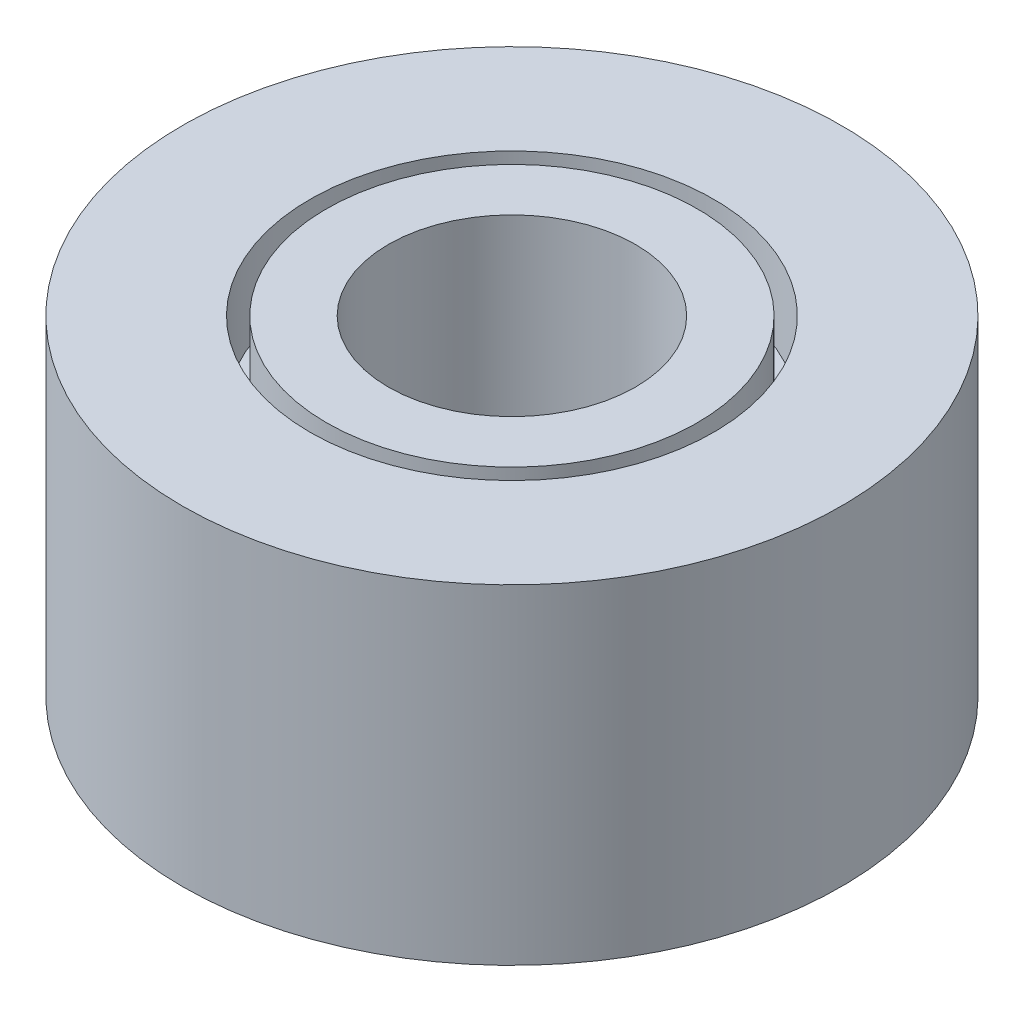
ISO-10303-21;
HEADER;
FILE_DESCRIPTION(('STEP AP214'),'2;1');
FILE_NAME('part.step','',(''),(''),'','','');
FILE_SCHEMA(('AUTOMOTIVE_DESIGN { 1 0 10303 214 1 1 1 1 }'));
ENDSEC;
DATA;
#1=APPLICATION_CONTEXT('core data for automotive mechanical design processes');
#2=APPLICATION_PROTOCOL_DEFINITION('international standard','automotive_design',2000,#1);
#3=PRODUCT_CONTEXT('',#1,'mechanical');
#4=PRODUCT('Part','Part','',(#3));
#5=PRODUCT_RELATED_PRODUCT_CATEGORY('part','',(#4));
#6=PRODUCT_DEFINITION_FORMATION('','',#4);
#7=PRODUCT_DEFINITION_CONTEXT('part definition',#1,'design');
#8=PRODUCT_DEFINITION('design','',#6,#7);
#9=PRODUCT_DEFINITION_SHAPE('','',#8);
#10=(LENGTH_UNIT() NAMED_UNIT(*) SI_UNIT(.MILLI.,.METRE.));
#11=(NAMED_UNIT(*) PLANE_ANGLE_UNIT() SI_UNIT($,.RADIAN.));
#12=(NAMED_UNIT(*) SI_UNIT($,.STERADIAN.) SOLID_ANGLE_UNIT());
#13=UNCERTAINTY_MEASURE_WITH_UNIT(LENGTH_MEASURE(1.E-05),#10,'distance_accuracy_value','');
#14=(GEOMETRIC_REPRESENTATION_CONTEXT(3) GLOBAL_UNCERTAINTY_ASSIGNED_CONTEXT((#13)) GLOBAL_UNIT_ASSIGNED_CONTEXT((#10,
#11,#12)) REPRESENTATION_CONTEXT('',''));
#15=CARTESIAN_POINT('',(0.,0.,0.));
#16=DIRECTION('',(0.,0.,1.));
#17=DIRECTION('',(1.,0.,0.));
#18=AXIS2_PLACEMENT_3D('',#15,#16,#17);
#19=CARTESIAN_POINT('',(0.,4.,0.));
#20=DIRECTION('',(0.,1.,0.));
#21=DIRECTION('',(0.,0.,1.));
#22=AXIS2_PLACEMENT_3D('',#19,#20,#21);
#23=PLANE('',#22);
#24=CARTESIAN_POINT('',(0.,4.,0.));
#25=DIRECTION('',(0.,1.,0.));
#26=DIRECTION('',(0.,0.,1.));
#27=AXIS2_PLACEMENT_3D('',#24,#25,#26);
#28=CIRCLE('',#27,1.5);
#29=CARTESIAN_POINT('',(0.,4.,1.5));
#30=VERTEX_POINT('',#29);
#31=EDGE_CURVE('E62',#30,#30,#28,.T.);
#32=ORIENTED_EDGE('',*,*,#31,.F.);
#33=EDGE_LOOP('',(#32));
#34=FACE_BOUND('',#33,.T.);
#35=CARTESIAN_POINT('',(0.,4.,0.));
#36=DIRECTION('',(0.,1.,0.));
#37=DIRECTION('',(0.,0.,1.));
#38=AXIS2_PLACEMENT_3D('',#35,#36,#37);
#39=CIRCLE('',#38,2.25);
#40=CARTESIAN_POINT('',(0.,4.,2.25));
#41=VERTEX_POINT('',#40);
#42=EDGE_CURVE('E88',#41,#41,#39,.T.);
#43=ORIENTED_EDGE('',*,*,#42,.T.);
#44=EDGE_LOOP('',(#43));
#45=FACE_BOUND('',#44,.T.);
#46=ADVANCED_FACE('F51',(#34,#45),#23,.T.);
#47=CARTESIAN_POINT('',(0.,0.,0.));
#48=DIRECTION('',(0.,1.,0.));
#49=DIRECTION('',(0.,0.,1.));
#50=AXIS2_PLACEMENT_3D('',#47,#48,#49);
#51=PLANE('',#50);
#52=CARTESIAN_POINT('',(0.,0.,0.));
#53=DIRECTION('',(0.,1.,0.));
#54=DIRECTION('',(0.,0.,1.));
#55=AXIS2_PLACEMENT_3D('',#52,#53,#54);
#56=CIRCLE('',#55,1.5);
#57=CARTESIAN_POINT('',(0.,0.,1.5));
#58=VERTEX_POINT('',#57);
#59=EDGE_CURVE('E64',#58,#58,#56,.T.);
#60=ORIENTED_EDGE('',*,*,#59,.T.);
#61=EDGE_LOOP('',(#60));
#62=FACE_BOUND('',#61,.T.);
#63=CARTESIAN_POINT('',(0.,0.,0.));
#64=DIRECTION('',(0.,1.,0.));
#65=DIRECTION('',(0.,0.,1.));
#66=AXIS2_PLACEMENT_3D('',#63,#64,#65);
#67=CIRCLE('',#66,2.25);
#68=CARTESIAN_POINT('',(0.,0.,2.25));
#69=VERTEX_POINT('',#68);
#70=EDGE_CURVE('E76',#69,#69,#67,.T.);
#71=ORIENTED_EDGE('',*,*,#70,.F.);
#72=EDGE_LOOP('',(#71));
#73=FACE_BOUND('',#72,.T.);
#74=ADVANCED_FACE('F113',(#62,#73),#51,.F.);
#75=CARTESIAN_POINT('',(0.,4.,0.));
#76=DIRECTION('',(0.,1.,0.));
#77=DIRECTION('',(0.,0.,1.));
#78=AXIS2_PLACEMENT_3D('',#75,#76,#77);
#79=CIRCLE('',#78,2.45);
#80=CARTESIAN_POINT('',(0.,4.,2.45));
#81=VERTEX_POINT('',#80);
#82=EDGE_CURVE('E82',#81,#81,#79,.T.);
#83=ORIENTED_EDGE('',*,*,#82,.F.);
#84=EDGE_LOOP('',(#83));
#85=FACE_BOUND('',#84,.T.);
#86=CARTESIAN_POINT('',(0.,4.,0.));
#87=DIRECTION('',(0.,1.,0.));
#88=DIRECTION('',(0.,0.,1.));
#89=AXIS2_PLACEMENT_3D('',#86,#87,#88);
#90=CIRCLE('',#89,4.);
#91=CARTESIAN_POINT('',(0.,4.,4.));
#92=VERTEX_POINT('',#91);
#93=EDGE_CURVE('E11',#92,#92,#90,.T.);
#94=ORIENTED_EDGE('',*,*,#93,.T.);
#95=EDGE_LOOP('',(#94));
#96=FACE_BOUND('',#95,.T.);
#97=ADVANCED_FACE('F110',(#85,#96),#23,.T.);
#98=CARTESIAN_POINT('',(0.,0.,0.));
#99=DIRECTION('',(0.,1.,0.));
#100=DIRECTION('',(1.,0.,0.));
#101=AXIS2_PLACEMENT_3D('',#98,#99,#100);
#102=CIRCLE('',#101,2.45);
#103=CARTESIAN_POINT('',(2.45,0.,0.));
#104=VERTEX_POINT('',#103);
#105=EDGE_CURVE('E70',#104,#104,#102,.T.);
#106=ORIENTED_EDGE('',*,*,#105,.T.);
#107=EDGE_LOOP('',(#106));
#108=FACE_BOUND('',#107,.T.);
#109=CARTESIAN_POINT('',(0.,0.,0.));
#110=DIRECTION('',(0.,1.,0.));
#111=DIRECTION('',(0.,0.,1.));
#112=AXIS2_PLACEMENT_3D('',#109,#110,#111);
#113=CIRCLE('',#112,4.);
#114=CARTESIAN_POINT('',(0.,0.,4.));
#115=VERTEX_POINT('',#114);
#116=EDGE_CURVE('E55',#115,#115,#113,.T.);
#117=ORIENTED_EDGE('',*,*,#116,.F.);
#118=EDGE_LOOP('',(#117));
#119=FACE_BOUND('',#118,.T.);
#120=ADVANCED_FACE('F112',(#108,#119),#51,.F.);
#121=CARTESIAN_POINT('',(0.,4.,0.));
#122=DIRECTION('',(0.,-1.,0.));
#123=DIRECTION('',(0.,0.,-1.));
#124=AXIS2_PLACEMENT_3D('',#121,#122,#123);
#125=CYLINDRICAL_SURFACE('',#124,4.);
#126=ORIENTED_EDGE('',*,*,#93,.F.);
#127=EDGE_LOOP('',(#126));
#128=FACE_BOUND('',#127,.T.);
#129=ORIENTED_EDGE('',*,*,#116,.T.);
#130=EDGE_LOOP('',(#129));
#131=FACE_BOUND('',#130,.T.);
#132=ADVANCED_FACE('F53',(#128,#131),#125,.T.);
#133=CARTESIAN_POINT('',(0.,4.,0.));
#134=DIRECTION('',(0.,-1.,0.));
#135=DIRECTION('',(0.,0.,-1.));
#136=AXIS2_PLACEMENT_3D('',#133,#134,#135);
#137=CYLINDRICAL_SURFACE('',#136,1.5);
#138=ORIENTED_EDGE('',*,*,#31,.T.);
#139=EDGE_LOOP('',(#138));
#140=FACE_BOUND('',#139,.T.);
#141=ORIENTED_EDGE('',*,*,#59,.F.);
#142=EDGE_LOOP('',(#141));
#143=FACE_BOUND('',#142,.T.);
#144=ADVANCED_FACE('F141',(#140,#143),#137,.F.);
#145=CARTESIAN_POINT('',(0.,1.,0.));
#146=DIRECTION('',(0.,1.,0.));
#147=DIRECTION('',(0.,0.,1.));
#148=AXIS2_PLACEMENT_3D('',#145,#146,#147);
#149=PLANE('',#148);
#150=CARTESIAN_POINT('',(0.,1.,0.));
#151=DIRECTION('',(0.,1.,0.));
#152=DIRECTION('',(1.,0.,0.));
#153=AXIS2_PLACEMENT_3D('',#150,#151,#152);
#154=CIRCLE('',#153,2.45);
#155=CARTESIAN_POINT('',(2.45,1.,0.));
#156=VERTEX_POINT('',#155);
#157=EDGE_CURVE('E67',#156,#156,#154,.T.);
#158=ORIENTED_EDGE('',*,*,#157,.F.);
#159=EDGE_LOOP('',(#158));
#160=FACE_BOUND('',#159,.T.);
#161=CARTESIAN_POINT('',(0.,1.,0.));
#162=DIRECTION('',(0.,1.,0.));
#163=DIRECTION('',(0.,0.,1.));
#164=AXIS2_PLACEMENT_3D('',#161,#162,#163);
#165=CIRCLE('',#164,2.25);
#166=CARTESIAN_POINT('',(0.,1.,2.25));
#167=VERTEX_POINT('',#166);
#168=EDGE_CURVE('E73',#167,#167,#165,.T.);
#169=ORIENTED_EDGE('',*,*,#168,.T.);
#170=EDGE_LOOP('',(#169));
#171=FACE_BOUND('',#170,.T.);
#172=ADVANCED_FACE('F138',(#160,#171),#149,.F.);
#173=CARTESIAN_POINT('',(0.,1.,0.));
#174=DIRECTION('',(0.,-1.,0.));
#175=DIRECTION('',(0.,0.,-1.));
#176=AXIS2_PLACEMENT_3D('',#173,#174,#175);
#177=CYLINDRICAL_SURFACE('',#176,2.45);
#178=ORIENTED_EDGE('',*,*,#157,.T.);
#179=EDGE_LOOP('',(#178));
#180=FACE_BOUND('',#179,.T.);
#181=ORIENTED_EDGE('',*,*,#105,.F.);
#182=EDGE_LOOP('',(#181));
#183=FACE_BOUND('',#182,.T.);
#184=ADVANCED_FACE('F136',(#180,#183),#177,.F.);
#185=CARTESIAN_POINT('',(0.,1.,0.));
#186=DIRECTION('',(0.,-1.,0.));
#187=DIRECTION('',(0.,0.,-1.));
#188=AXIS2_PLACEMENT_3D('',#185,#186,#187);
#189=CYLINDRICAL_SURFACE('',#188,2.25);
#190=ORIENTED_EDGE('',*,*,#168,.F.);
#191=EDGE_LOOP('',(#190));
#192=FACE_BOUND('',#191,.T.);
#193=ORIENTED_EDGE('',*,*,#70,.T.);
#194=EDGE_LOOP('',(#193));
#195=FACE_BOUND('',#194,.T.);
#196=ADVANCED_FACE('F106',(#192,#195),#189,.T.);
#197=CARTESIAN_POINT('',(0.,3.,0.));
#198=DIRECTION('',(0.,1.,0.));
#199=DIRECTION('',(0.,0.,1.));
#200=AXIS2_PLACEMENT_3D('',#197,#198,#199);
#201=CYLINDRICAL_SURFACE('',#200,2.45);
#202=CARTESIAN_POINT('',(0.,3.,0.));
#203=DIRECTION('',(0.,1.,0.));
#204=DIRECTION('',(0.,0.,1.));
#205=AXIS2_PLACEMENT_3D('',#202,#203,#204);
#206=CIRCLE('',#205,2.45);
#207=CARTESIAN_POINT('',(0.,3.,2.45));
#208=VERTEX_POINT('',#207);
#209=EDGE_CURVE('E79',#208,#208,#206,.T.);
#210=ORIENTED_EDGE('',*,*,#209,.F.);
#211=EDGE_LOOP('',(#210));
#212=FACE_BOUND('',#211,.T.);
#213=ORIENTED_EDGE('',*,*,#82,.T.);
#214=EDGE_LOOP('',(#213));
#215=FACE_BOUND('',#214,.T.);
#216=ADVANCED_FACE('F100',(#212,#215),#201,.F.);
#217=CARTESIAN_POINT('',(0.,3.,0.));
#218=DIRECTION('',(0.,1.,0.));
#219=DIRECTION('',(0.,0.,1.));
#220=AXIS2_PLACEMENT_3D('',#217,#218,#219);
#221=PLANE('',#220);
#222=CARTESIAN_POINT('',(0.,3.,0.));
#223=DIRECTION('',(0.,1.,0.));
#224=DIRECTION('',(0.,0.,1.));
#225=AXIS2_PLACEMENT_3D('',#222,#223,#224);
#226=CIRCLE('',#225,2.25);
#227=CARTESIAN_POINT('',(0.,3.,2.25));
#228=VERTEX_POINT('',#227);
#229=EDGE_CURVE('E85',#228,#228,#226,.T.);
#230=ORIENTED_EDGE('',*,*,#229,.F.);
#231=EDGE_LOOP('',(#230));
#232=FACE_BOUND('',#231,.T.);
#233=ORIENTED_EDGE('',*,*,#209,.T.);
#234=EDGE_LOOP('',(#233));
#235=FACE_BOUND('',#234,.T.);
#236=ADVANCED_FACE('F97',(#232,#235),#221,.T.);
#237=CARTESIAN_POINT('',(0.,3.,0.));
#238=DIRECTION('',(0.,1.,0.));
#239=DIRECTION('',(0.,0.,1.));
#240=AXIS2_PLACEMENT_3D('',#237,#238,#239);
#241=CYLINDRICAL_SURFACE('',#240,2.25);
#242=ORIENTED_EDGE('',*,*,#229,.T.);
#243=EDGE_LOOP('',(#242));
#244=FACE_BOUND('',#243,.T.);
#245=ORIENTED_EDGE('',*,*,#42,.F.);
#246=EDGE_LOOP('',(#245));
#247=FACE_BOUND('',#246,.T.);
#248=ADVANCED_FACE('F94',(#244,#247),#241,.T.);
#249=CLOSED_SHELL('',(#46,#74,#97,#120,#132,#144,#172,#184,#196,#216,#236,#248));
#250=MANIFOLD_SOLID_BREP('B2',#249);
#251=ADVANCED_BREP_SHAPE_REPRESENTATION('',(#18,#250),#14);
#252=SHAPE_DEFINITION_REPRESENTATION(#9,#251);
ENDSEC;
END-ISO-10303-21;
